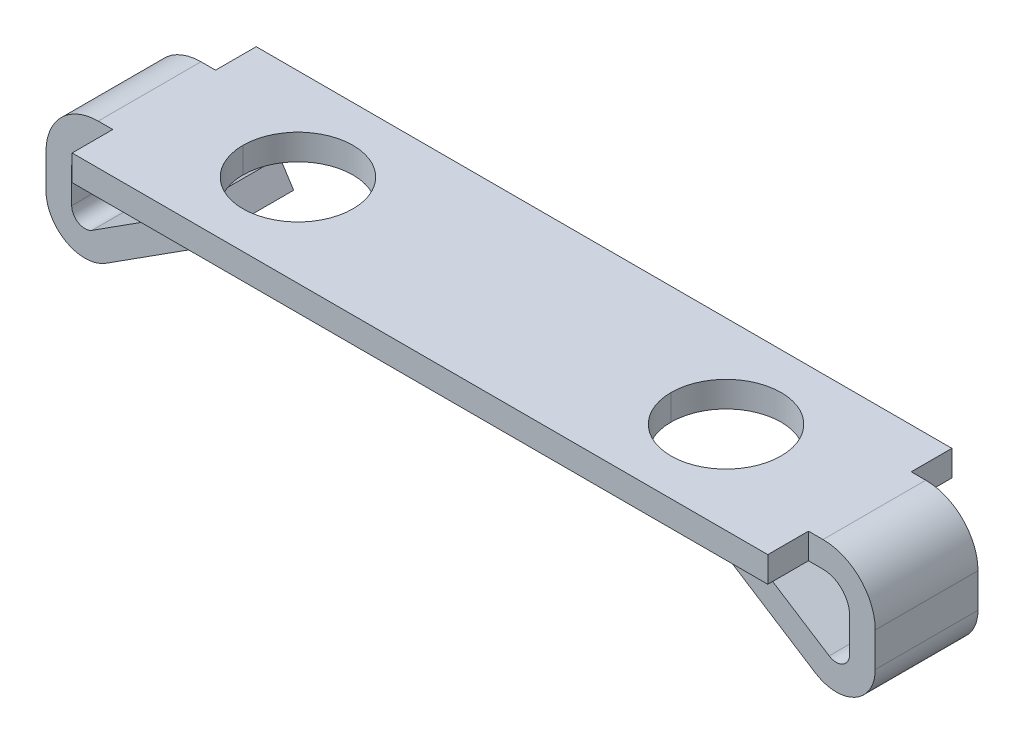
ISO-10303-21;
HEADER;
FILE_DESCRIPTION(('STEP AP214'),'2;1');
FILE_NAME('part.step','',(''),(''),'','','');
FILE_SCHEMA(('AUTOMOTIVE_DESIGN { 1 0 10303 214 1 1 1 1 }'));
ENDSEC;
DATA;
#1=APPLICATION_CONTEXT('core data for automotive mechanical design processes');
#2=APPLICATION_PROTOCOL_DEFINITION('international standard','automotive_design',2000,#1);
#3=PRODUCT_CONTEXT('',#1,'mechanical');
#4=PRODUCT('Part','Part','',(#3));
#5=PRODUCT_RELATED_PRODUCT_CATEGORY('part','',(#4));
#6=PRODUCT_DEFINITION_FORMATION('','',#4);
#7=PRODUCT_DEFINITION_CONTEXT('part definition',#1,'design');
#8=PRODUCT_DEFINITION('design','',#6,#7);
#9=PRODUCT_DEFINITION_SHAPE('','',#8);
#10=(LENGTH_UNIT() NAMED_UNIT(*) SI_UNIT(.MILLI.,.METRE.));
#11=(NAMED_UNIT(*) PLANE_ANGLE_UNIT() SI_UNIT($,.RADIAN.));
#12=(NAMED_UNIT(*) SI_UNIT($,.STERADIAN.) SOLID_ANGLE_UNIT());
#13=UNCERTAINTY_MEASURE_WITH_UNIT(LENGTH_MEASURE(1.E-05),#10,'distance_accuracy_value','');
#14=(GEOMETRIC_REPRESENTATION_CONTEXT(3) GLOBAL_UNCERTAINTY_ASSIGNED_CONTEXT((#13)) GLOBAL_UNIT_ASSIGNED_CONTEXT((#10,
#11,#12)) REPRESENTATION_CONTEXT('',''));
#15=CARTESIAN_POINT('',(0.,0.,0.));
#16=DIRECTION('',(0.,0.,1.));
#17=DIRECTION('',(1.,0.,0.));
#18=AXIS2_PLACEMENT_3D('',#15,#16,#17);
#19=CARTESIAN_POINT('',(21.50018814,1.524,3.048));
#20=DIRECTION('',(0.,-1.,0.));
#21=DIRECTION('',(0.,0.,-1.));
#22=AXIS2_PLACEMENT_3D('',#19,#20,#21);
#23=PLANE('',#22);
#24=CARTESIAN_POINT('',(12.69908814,1.524,0.));
#25=DIRECTION('',(0.,1.,0.));
#26=DIRECTION('',(1.,0.,0.));
#27=AXIS2_PLACEMENT_3D('',#24,#25,#26);
#28=CIRCLE('',#27,3.2639);
#29=CARTESIAN_POINT('',(15.96298814,1.524,0.));
#30=VERTEX_POINT('',#29);
#31=CARTESIAN_POINT('',(9.43518814,1.524,0.));
#32=VERTEX_POINT('',#31);
#33=EDGE_CURVE('E11',#30,#32,#28,.T.);
#34=ORIENTED_EDGE('',*,*,#33,.F.);
#35=CARTESIAN_POINT('',(12.69908814,1.524,0.));
#36=DIRECTION('',(0.,1.,0.));
#37=DIRECTION('',(1.,0.,0.));
#38=AXIS2_PLACEMENT_3D('',#35,#36,#37);
#39=CIRCLE('',#38,3.2639);
#40=EDGE_CURVE('E25',#32,#30,#39,.T.);
#41=ORIENTED_EDGE('',*,*,#40,.F.);
#42=EDGE_LOOP('',(#34,#41));
#43=FACE_BOUND('',#42,.T.);
#44=CARTESIAN_POINT('',(-12.69908814,1.524,0.));
#45=DIRECTION('',(0.,1.,0.));
#46=DIRECTION('',(1.,0.,0.));
#47=AXIS2_PLACEMENT_3D('',#44,#45,#46);
#48=CIRCLE('',#47,3.2639);
#49=CARTESIAN_POINT('',(-9.43518814,1.524,0.));
#50=VERTEX_POINT('',#49);
#51=CARTESIAN_POINT('',(-15.96298814,1.524,0.));
#52=VERTEX_POINT('',#51);
#53=EDGE_CURVE('E617',#50,#52,#48,.T.);
#54=ORIENTED_EDGE('',*,*,#53,.F.);
#55=CARTESIAN_POINT('',(-12.69908814,1.524,0.));
#56=DIRECTION('',(0.,1.,0.));
#57=DIRECTION('',(1.,0.,0.));
#58=AXIS2_PLACEMENT_3D('',#55,#56,#57);
#59=CIRCLE('',#58,3.2639);
#60=EDGE_CURVE('E612',#52,#50,#59,.T.);
#61=ORIENTED_EDGE('',*,*,#60,.F.);
#62=EDGE_LOOP('',(#54,#61));
#63=FACE_BOUND('',#62,.T.);
#64=DIRECTION('',(0.,0.,-1.));
#65=VECTOR('',#64,1.);
#66=CARTESIAN_POINT('',(20.63658814,1.524,5.461));
#67=LINE('',#66,#65);
#68=CARTESIAN_POINT('',(20.63658814,1.524,5.461));
#69=VERTEX_POINT('',#68);
#70=CARTESIAN_POINT('',(20.63658814,1.524,3.048));
#71=VERTEX_POINT('',#70);
#72=EDGE_CURVE('E608',#69,#71,#67,.T.);
#73=ORIENTED_EDGE('',*,*,#72,.T.);
#74=DIRECTION('',(-1.,0.,0.));
#75=VECTOR('',#74,1.);
#76=CARTESIAN_POINT('',(21.50018814,1.524,3.048));
#77=LINE('',#76,#75);
#78=CARTESIAN_POINT('',(21.50018814,1.524,3.048));
#79=VERTEX_POINT('',#78);
#80=EDGE_CURVE('E603',#79,#71,#77,.T.);
#81=ORIENTED_EDGE('',*,*,#80,.F.);
#82=DIRECTION('',(0.,0.,-1.));
#83=VECTOR('',#82,1.);
#84=CARTESIAN_POINT('',(21.50018814,1.524,3.048));
#85=LINE('',#84,#83);
#86=CARTESIAN_POINT('',(21.50018814,1.524,-3.048));
#87=VERTEX_POINT('',#86);
#88=EDGE_CURVE('E599',#79,#87,#85,.T.);
#89=ORIENTED_EDGE('',*,*,#88,.T.);
#90=DIRECTION('',(-1.,0.,0.));
#91=VECTOR('',#90,1.);
#92=CARTESIAN_POINT('',(21.50018814,1.524,-3.048));
#93=LINE('',#92,#91);
#94=CARTESIAN_POINT('',(20.63658814,1.524,-3.048));
#95=VERTEX_POINT('',#94);
#96=EDGE_CURVE('E595',#87,#95,#93,.T.);
#97=ORIENTED_EDGE('',*,*,#96,.T.);
#98=DIRECTION('',(0.,0.,-1.));
#99=VECTOR('',#98,1.);
#100=CARTESIAN_POINT('',(20.63658814,1.524,5.461));
#101=LINE('',#100,#99);
#102=CARTESIAN_POINT('',(20.63658814,1.524,-5.461));
#103=VERTEX_POINT('',#102);
#104=EDGE_CURVE('E591',#95,#103,#101,.T.);
#105=ORIENTED_EDGE('',*,*,#104,.T.);
#106=DIRECTION('',(-1.,0.,0.));
#107=VECTOR('',#106,1.);
#108=CARTESIAN_POINT('',(20.63658814,1.524,-5.461));
#109=LINE('',#108,#107);
#110=CARTESIAN_POINT('',(-20.63658814,1.524,-5.461));
#111=VERTEX_POINT('',#110);
#112=EDGE_CURVE('E587',#103,#111,#109,.T.);
#113=ORIENTED_EDGE('',*,*,#112,.T.);
#114=DIRECTION('',(0.,0.,1.));
#115=VECTOR('',#114,1.);
#116=CARTESIAN_POINT('',(-20.63658814,1.524,-5.461));
#117=LINE('',#116,#115);
#118=CARTESIAN_POINT('',(-20.63658814,1.524,-3.048));
#119=VERTEX_POINT('',#118);
#120=EDGE_CURVE('E583',#111,#119,#117,.T.);
#121=ORIENTED_EDGE('',*,*,#120,.T.);
#122=DIRECTION('',(-1.,0.,0.));
#123=VECTOR('',#122,1.);
#124=CARTESIAN_POINT('',(21.50018814,1.524,-3.048));
#125=LINE('',#124,#123);
#126=CARTESIAN_POINT('',(-21.50018814,1.524,-3.048));
#127=VERTEX_POINT('',#126);
#128=EDGE_CURVE('E579',#119,#127,#125,.T.);
#129=ORIENTED_EDGE('',*,*,#128,.T.);
#130=DIRECTION('',(0.,0.,-1.));
#131=VECTOR('',#130,1.);
#132=CARTESIAN_POINT('',(-21.50018814,1.524,3.048));
#133=LINE('',#132,#131);
#134=CARTESIAN_POINT('',(-21.50018814,1.524,3.048));
#135=VERTEX_POINT('',#134);
#136=EDGE_CURVE('E574',#135,#127,#133,.T.);
#137=ORIENTED_EDGE('',*,*,#136,.F.);
#138=DIRECTION('',(-1.,0.,0.));
#139=VECTOR('',#138,1.);
#140=CARTESIAN_POINT('',(21.50018814,1.524,3.048));
#141=LINE('',#140,#139);
#142=CARTESIAN_POINT('',(-20.63658814,1.524,3.048));
#143=VERTEX_POINT('',#142);
#144=EDGE_CURVE('E569',#143,#135,#141,.T.);
#145=ORIENTED_EDGE('',*,*,#144,.F.);
#146=DIRECTION('',(0.,0.,1.));
#147=VECTOR('',#146,1.);
#148=CARTESIAN_POINT('',(-20.63658814,1.524,-5.461));
#149=LINE('',#148,#147);
#150=CARTESIAN_POINT('',(-20.63658814,1.524,5.461));
#151=VERTEX_POINT('',#150);
#152=EDGE_CURVE('E565',#143,#151,#149,.T.);
#153=ORIENTED_EDGE('',*,*,#152,.T.);
#154=DIRECTION('',(1.,0.,0.));
#155=VECTOR('',#154,1.);
#156=CARTESIAN_POINT('',(-20.63658814,1.524,5.461));
#157=LINE('',#156,#155);
#158=EDGE_CURVE('E561',#151,#69,#157,.T.);
#159=ORIENTED_EDGE('',*,*,#158,.T.);
#160=EDGE_LOOP('',(#73,#81,#89,#97,#105,#113,#121,#129,#137,#145,#153,#159));
#161=FACE_BOUND('',#160,.T.);
#162=ADVANCED_FACE('F17',(#43,#63,#161),#23,.F.);
#163=CARTESIAN_POINT('',(-20.63658814,1.524,5.461));
#164=DIRECTION('',(0.,0.,-1.));
#165=DIRECTION('',(-1.,0.,0.));
#166=AXIS2_PLACEMENT_3D('',#163,#164,#165);
#167=PLANE('',#166);
#168=DIRECTION('',(1.,0.,0.));
#169=VECTOR('',#168,1.);
#170=CARTESIAN_POINT('',(-20.63658814,0.,5.461));
#171=LINE('',#170,#169);
#172=CARTESIAN_POINT('',(-20.63658814,0.,5.461));
#173=VERTEX_POINT('',#172);
#174=CARTESIAN_POINT('',(20.63658814,0.,5.461));
#175=VERTEX_POINT('',#174);
#176=EDGE_CURVE('E557',#173,#175,#171,.T.);
#177=ORIENTED_EDGE('',*,*,#176,.T.);
#178=DIRECTION('',(0.,-1.,0.));
#179=VECTOR('',#178,1.);
#180=CARTESIAN_POINT('',(20.63658814,1.524,5.461));
#181=LINE('',#180,#179);
#182=EDGE_CURVE('E552',#69,#175,#181,.T.);
#183=ORIENTED_EDGE('',*,*,#182,.F.);
#184=ORIENTED_EDGE('',*,*,#158,.F.);
#185=DIRECTION('',(0.,-1.,0.));
#186=VECTOR('',#185,1.);
#187=CARTESIAN_POINT('',(-20.63658814,1.524,5.461));
#188=LINE('',#187,#186);
#189=EDGE_CURVE('E548',#151,#173,#188,.T.);
#190=ORIENTED_EDGE('',*,*,#189,.T.);
#191=EDGE_LOOP('',(#177,#183,#184,#190));
#192=FACE_BOUND('',#191,.T.);
#193=ADVANCED_FACE('F723',(#192),#167,.F.);
#194=CARTESIAN_POINT('',(-20.63658814,1.524,-5.461));
#195=DIRECTION('',(1.,0.,0.));
#196=DIRECTION('',(0.,0.,-1.));
#197=AXIS2_PLACEMENT_3D('',#194,#195,#196);
#198=PLANE('',#197);
#199=DIRECTION('',(0.,1.,0.));
#200=VECTOR('',#199,1.);
#201=CARTESIAN_POINT('',(-20.63658814,-3.60679999999942,3.048));
#202=LINE('',#201,#200);
#203=CARTESIAN_POINT('',(-20.63658814,0.,3.048));
#204=VERTEX_POINT('',#203);
#205=EDGE_CURVE('E543',#204,#143,#202,.T.);
#206=ORIENTED_EDGE('',*,*,#205,.F.);
#207=DIRECTION('',(0.,0.,1.));
#208=VECTOR('',#207,1.);
#209=CARTESIAN_POINT('',(-20.63658814,0.,-5.461));
#210=LINE('',#209,#208);
#211=EDGE_CURVE('E538',#204,#173,#210,.T.);
#212=ORIENTED_EDGE('',*,*,#211,.T.);
#213=ORIENTED_EDGE('',*,*,#189,.F.);
#214=ORIENTED_EDGE('',*,*,#152,.F.);
#215=EDGE_LOOP('',(#206,#212,#213,#214));
#216=FACE_BOUND('',#215,.T.);
#217=ADVANCED_FACE('F728',(#216),#198,.F.);
#218=CARTESIAN_POINT('',(-21.50018814,0.,3.048));
#219=DIRECTION('',(0.,1.,0.));
#220=DIRECTION('',(0.,0.,1.));
#221=AXIS2_PLACEMENT_3D('',#218,#219,#220);
#222=PLANE('',#221);
#223=CARTESIAN_POINT('',(12.69908814,0.,0.));
#224=DIRECTION('',(0.,1.,0.));
#225=DIRECTION('',(1.,0.,0.));
#226=AXIS2_PLACEMENT_3D('',#223,#224,#225);
#227=CIRCLE('',#226,3.2639);
#228=CARTESIAN_POINT('',(15.96298814,0.,0.));
#229=VERTEX_POINT('',#228);
#230=CARTESIAN_POINT('',(9.43518814,0.,0.));
#231=VERTEX_POINT('',#230);
#232=EDGE_CURVE('E534',#229,#231,#227,.T.);
#233=ORIENTED_EDGE('',*,*,#232,.T.);
#234=CARTESIAN_POINT('',(12.69908814,0.,0.));
#235=DIRECTION('',(0.,1.,0.));
#236=DIRECTION('',(1.,0.,0.));
#237=AXIS2_PLACEMENT_3D('',#234,#235,#236);
#238=CIRCLE('',#237,3.2639);
#239=EDGE_CURVE('E530',#231,#229,#238,.T.);
#240=ORIENTED_EDGE('',*,*,#239,.T.);
#241=EDGE_LOOP('',(#233,#240));
#242=FACE_BOUND('',#241,.T.);
#243=CARTESIAN_POINT('',(-12.69908814,0.,0.));
#244=DIRECTION('',(0.,1.,0.));
#245=DIRECTION('',(1.,0.,0.));
#246=AXIS2_PLACEMENT_3D('',#243,#244,#245);
#247=CIRCLE('',#246,3.2639);
#248=CARTESIAN_POINT('',(-9.43518814,0.,0.));
#249=VERTEX_POINT('',#248);
#250=CARTESIAN_POINT('',(-15.96298814,0.,0.));
#251=VERTEX_POINT('',#250);
#252=EDGE_CURVE('E526',#249,#251,#247,.T.);
#253=ORIENTED_EDGE('',*,*,#252,.T.);
#254=CARTESIAN_POINT('',(-12.69908814,0.,0.));
#255=DIRECTION('',(0.,1.,0.));
#256=DIRECTION('',(1.,0.,0.));
#257=AXIS2_PLACEMENT_3D('',#254,#255,#256);
#258=CIRCLE('',#257,3.2639);
#259=EDGE_CURVE('E522',#251,#249,#258,.T.);
#260=ORIENTED_EDGE('',*,*,#259,.T.);
#261=EDGE_LOOP('',(#253,#260));
#262=FACE_BOUND('',#261,.T.);
#263=DIRECTION('',(0.,0.,-1.));
#264=VECTOR('',#263,1.);
#265=CARTESIAN_POINT('',(20.63658814,0.,5.461));
#266=LINE('',#265,#264);
#267=CARTESIAN_POINT('',(20.63658814,0.,-3.048));
#268=VERTEX_POINT('',#267);
#269=CARTESIAN_POINT('',(20.63658814,0.,-5.461));
#270=VERTEX_POINT('',#269);
#271=EDGE_CURVE('E517',#268,#270,#266,.T.);
#272=ORIENTED_EDGE('',*,*,#271,.F.);
#273=DIRECTION('',(1.,0.,0.));
#274=VECTOR('',#273,1.);
#275=CARTESIAN_POINT('',(-21.50018814,0.,-3.048));
#276=LINE('',#275,#274);
#277=CARTESIAN_POINT('',(21.50018814,0.,-3.048));
#278=VERTEX_POINT('',#277);
#279=EDGE_CURVE('E513',#268,#278,#276,.T.);
#280=ORIENTED_EDGE('',*,*,#279,.T.);
#281=DIRECTION('',(0.,0.,-1.));
#282=VECTOR('',#281,1.);
#283=CARTESIAN_POINT('',(21.50018814,0.,3.048));
#284=LINE('',#283,#282);
#285=CARTESIAN_POINT('',(21.50018814,0.,3.048));
#286=VERTEX_POINT('',#285);
#287=EDGE_CURVE('E508',#286,#278,#284,.T.);
#288=ORIENTED_EDGE('',*,*,#287,.F.);
#289=DIRECTION('',(1.,0.,0.));
#290=VECTOR('',#289,1.);
#291=CARTESIAN_POINT('',(-21.50018814,0.,3.048));
#292=LINE('',#291,#290);
#293=CARTESIAN_POINT('',(20.63658814,0.,3.048));
#294=VERTEX_POINT('',#293);
#295=EDGE_CURVE('E503',#294,#286,#292,.T.);
#296=ORIENTED_EDGE('',*,*,#295,.F.);
#297=DIRECTION('',(0.,0.,-1.));
#298=VECTOR('',#297,1.);
#299=CARTESIAN_POINT('',(20.63658814,0.,5.461));
#300=LINE('',#299,#298);
#301=EDGE_CURVE('E498',#175,#294,#300,.T.);
#302=ORIENTED_EDGE('',*,*,#301,.F.);
#303=ORIENTED_EDGE('',*,*,#176,.F.);
#304=ORIENTED_EDGE('',*,*,#211,.F.);
#305=DIRECTION('',(1.,0.,0.));
#306=VECTOR('',#305,1.);
#307=CARTESIAN_POINT('',(-21.50018814,0.,3.048));
#308=LINE('',#307,#306);
#309=CARTESIAN_POINT('',(-21.50018814,0.,3.048));
#310=VERTEX_POINT('',#309);
#311=EDGE_CURVE('E494',#310,#204,#308,.T.);
#312=ORIENTED_EDGE('',*,*,#311,.F.);
#313=DIRECTION('',(0.,0.,-1.));
#314=VECTOR('',#313,1.);
#315=CARTESIAN_POINT('',(-21.50018814,0.,3.048));
#316=LINE('',#315,#314);
#317=CARTESIAN_POINT('',(-21.50018814,0.,-3.048));
#318=VERTEX_POINT('',#317);
#319=EDGE_CURVE('E240',#310,#318,#316,.T.);
#320=ORIENTED_EDGE('',*,*,#319,.T.);
#321=DIRECTION('',(1.,0.,0.));
#322=VECTOR('',#321,1.);
#323=CARTESIAN_POINT('',(-21.50018814,0.,-3.048));
#324=LINE('',#323,#322);
#325=CARTESIAN_POINT('',(-20.63658814,0.,-3.048));
#326=VERTEX_POINT('',#325);
#327=EDGE_CURVE('E487',#318,#326,#324,.T.);
#328=ORIENTED_EDGE('',*,*,#327,.T.);
#329=DIRECTION('',(0.,0.,1.));
#330=VECTOR('',#329,1.);
#331=CARTESIAN_POINT('',(-20.63658814,0.,-5.461));
#332=LINE('',#331,#330);
#333=CARTESIAN_POINT('',(-20.63658814,0.,-5.461));
#334=VERTEX_POINT('',#333);
#335=EDGE_CURVE('E482',#334,#326,#332,.T.);
#336=ORIENTED_EDGE('',*,*,#335,.F.);
#337=DIRECTION('',(-1.,0.,0.));
#338=VECTOR('',#337,1.);
#339=CARTESIAN_POINT('',(20.63658814,0.,-5.461));
#340=LINE('',#339,#338);
#341=EDGE_CURVE('E477',#270,#334,#340,.T.);
#342=ORIENTED_EDGE('',*,*,#341,.F.);
#343=EDGE_LOOP('',(#272,#280,#288,#296,#302,#303,#304,#312,#320,#328,#336,#342));
#344=FACE_BOUND('',#343,.T.);
#345=ADVANCED_FACE('F691',(#242,#262,#344),#222,.F.);
#346=CARTESIAN_POINT('',(20.63658814,1.524,-5.461));
#347=DIRECTION('',(0.,0.,1.));
#348=DIRECTION('',(1.,0.,0.));
#349=AXIS2_PLACEMENT_3D('',#346,#347,#348);
#350=PLANE('',#349);
#351=ORIENTED_EDGE('',*,*,#341,.T.);
#352=DIRECTION('',(0.,-1.,0.));
#353=VECTOR('',#352,1.);
#354=CARTESIAN_POINT('',(-20.63658814,1.524,-5.461));
#355=LINE('',#354,#353);
#356=EDGE_CURVE('E472',#111,#334,#355,.T.);
#357=ORIENTED_EDGE('',*,*,#356,.F.);
#358=ORIENTED_EDGE('',*,*,#112,.F.);
#359=DIRECTION('',(0.,-1.,0.));
#360=VECTOR('',#359,1.);
#361=CARTESIAN_POINT('',(20.63658814,1.524,-5.461));
#362=LINE('',#361,#360);
#363=EDGE_CURVE('E467',#103,#270,#362,.T.);
#364=ORIENTED_EDGE('',*,*,#363,.T.);
#365=EDGE_LOOP('',(#351,#357,#358,#364));
#366=FACE_BOUND('',#365,.T.);
#367=ADVANCED_FACE('F698',(#366),#350,.F.);
#368=CARTESIAN_POINT('',(20.63658814,1.524,5.461));
#369=DIRECTION('',(-1.,0.,0.));
#370=DIRECTION('',(0.,0.,1.));
#371=AXIS2_PLACEMENT_3D('',#368,#369,#370);
#372=PLANE('',#371);
#373=ORIENTED_EDGE('',*,*,#104,.F.);
#374=DIRECTION('',(0.,-1.,0.));
#375=VECTOR('',#374,1.);
#376=CARTESIAN_POINT('',(20.63658814,-3.60679999999942,-3.048));
#377=LINE('',#376,#375);
#378=EDGE_CURVE('E462',#95,#268,#377,.T.);
#379=ORIENTED_EDGE('',*,*,#378,.T.);
#380=ORIENTED_EDGE('',*,*,#271,.T.);
#381=ORIENTED_EDGE('',*,*,#363,.F.);
#382=EDGE_LOOP('',(#373,#379,#380,#381));
#383=FACE_BOUND('',#382,.T.);
#384=ADVANCED_FACE('F704',(#383),#372,.F.);
#385=CARTESIAN_POINT('',(-22.2875881399995,-3.60679999999942,-3.048));
#386=DIRECTION('',(0.,0.,1.));
#387=DIRECTION('',(1.,0.,0.));
#388=AXIS2_PLACEMENT_3D('',#385,#386,#387);
#389=PLANE('',#388);
#390=ORIENTED_EDGE('',*,*,#378,.F.);
#391=ORIENTED_EDGE('',*,*,#96,.F.);
#392=CARTESIAN_POINT('',(21.5001881400002,-1.57479999999979,-3.048));
#393=DIRECTION('',(0.,0.,1.));
#394=DIRECTION('',(1.,0.,0.));
#395=AXIS2_PLACEMENT_3D('',#392,#393,#394);
#396=CIRCLE('',#395,3.0988);
#397=CARTESIAN_POINT('',(24.59898814,-1.5748,-3.048));
#398=VERTEX_POINT('',#397);
#399=EDGE_CURVE('E457',#398,#87,#396,.T.);
#400=ORIENTED_EDGE('',*,*,#399,.F.);
#401=DIRECTION('',(0.,1.,0.));
#402=VECTOR('',#401,1.);
#403=CARTESIAN_POINT('',(24.59898814,-3.6068,-3.048));
#404=LINE('',#403,#402);
#405=CARTESIAN_POINT('',(24.59898814,-3.6068,-3.048));
#406=VERTEX_POINT('',#405);
#407=EDGE_CURVE('E452',#406,#398,#404,.T.);
#408=ORIENTED_EDGE('',*,*,#407,.F.);
#409=CARTESIAN_POINT('',(22.2875881399995,-3.60679999999942,-3.048));
#410=DIRECTION('',(0.,0.,1.));
#411=DIRECTION('',(1.,0.,0.));
#412=AXIS2_PLACEMENT_3D('',#409,#410,#411);
#413=CIRCLE('',#412,2.3114);
#414=CARTESIAN_POINT('',(21.041911256647,-5.5538128562188,-3.048));
#415=VERTEX_POINT('',#414);
#416=EDGE_CURVE('E447',#415,#406,#413,.T.);
#417=ORIENTED_EDGE('',*,*,#416,.F.);
#418=DIRECTION('',(0.842352191839881,-0.538927439366886,0.));
#419=VECTOR('',#418,1.);
#420=CARTESIAN_POINT('',(16.002,-2.329334432,-3.048));
#421=LINE('',#420,#419);
#422=CARTESIAN_POINT('',(16.002,-2.329334432,-3.048));
#423=VERTEX_POINT('',#422);
#424=EDGE_CURVE('E442',#423,#415,#421,.T.);
#425=ORIENTED_EDGE('',*,*,#424,.F.);
#426=DIRECTION('',(-0.538927439366818,-0.842352191839924,0.));
#427=VECTOR('',#426,1.);
#428=CARTESIAN_POINT('',(16.823325417595,-1.045589691636,-3.048));
#429=LINE('',#428,#427);
#430=CARTESIAN_POINT('',(16.823325417595,-1.045589691636,-3.048));
#431=VERTEX_POINT('',#430);
#432=EDGE_CURVE('E437',#431,#423,#429,.T.);
#433=ORIENTED_EDGE('',*,*,#432,.F.);
#434=DIRECTION('',(-0.842352191839937,0.538927439366798,0.));
#435=VECTOR('',#434,1.);
#436=CARTESIAN_POINT('',(21.863236674243,-4.27006811585469,-3.048));
#437=LINE('',#436,#435);
#438=CARTESIAN_POINT('',(21.863236674243,-4.27006811585469,-3.048));
#439=VERTEX_POINT('',#438);
#440=EDGE_CURVE('E432',#439,#431,#437,.T.);
#441=ORIENTED_EDGE('',*,*,#440,.F.);
#442=CARTESIAN_POINT('',(22.2875881400002,-3.60679999999997,-3.048));
#443=DIRECTION('',(0.,0.,1.));
#444=DIRECTION('',(1.,0.,0.));
#445=AXIS2_PLACEMENT_3D('',#442,#443,#444);
#446=CIRCLE('',#445,0.7874);
#447=CARTESIAN_POINT('',(23.07498814,-3.6068,-3.048));
#448=VERTEX_POINT('',#447);
#449=EDGE_CURVE('E428',#439,#448,#446,.T.);
#450=ORIENTED_EDGE('',*,*,#449,.T.);
#451=DIRECTION('',(0.,-1.,0.));
#452=VECTOR('',#451,1.);
#453=CARTESIAN_POINT('',(23.07498814,-1.5748,-3.048));
#454=LINE('',#453,#452);
#455=CARTESIAN_POINT('',(23.07498814,-1.5748,-3.048));
#456=VERTEX_POINT('',#455);
#457=EDGE_CURVE('E423',#456,#448,#454,.T.);
#458=ORIENTED_EDGE('',*,*,#457,.F.);
#459=CARTESIAN_POINT('',(21.5001881400007,-1.57479999999926,-3.048));
#460=DIRECTION('',(0.,0.,1.));
#461=DIRECTION('',(1.,0.,0.));
#462=AXIS2_PLACEMENT_3D('',#459,#460,#461);
#463=CIRCLE('',#462,1.5748);
#464=EDGE_CURVE('E418',#456,#278,#463,.T.);
#465=ORIENTED_EDGE('',*,*,#464,.T.);
#466=ORIENTED_EDGE('',*,*,#279,.F.);
#467=EDGE_LOOP('',(#390,#391,#400,#408,#417,#425,#433,#441,#450,#458,#465,#466));
#468=FACE_BOUND('',#467,.T.);
#469=ADVANCED_FACE('F707',(#468),#389,.F.);
#470=CARTESIAN_POINT('',(21.5001881400007,-1.57479999999926,3.048));
#471=DIRECTION('',(0.,0.,1.));
#472=DIRECTION('',(-0.707106781186548,-0.707106781186547,0.));
#473=AXIS2_PLACEMENT_3D('',#470,#471,#472);
#474=CYLINDRICAL_SURFACE('',#473,1.5748);
#475=ORIENTED_EDGE('',*,*,#287,.T.);
#476=ORIENTED_EDGE('',*,*,#464,.F.);
#477=DIRECTION('',(0.,0.,-1.));
#478=VECTOR('',#477,1.);
#479=CARTESIAN_POINT('',(23.07498814,-1.5748,3.048));
#480=LINE('',#479,#478);
#481=CARTESIAN_POINT('',(23.07498814,-1.5748,3.048));
#482=VERTEX_POINT('',#481);
#483=EDGE_CURVE('E413',#482,#456,#480,.T.);
#484=ORIENTED_EDGE('',*,*,#483,.F.);
#485=CARTESIAN_POINT('',(21.5001881400007,-1.57479999999926,3.048));
#486=DIRECTION('',(0.,0.,1.));
#487=DIRECTION('',(1.,0.,0.));
#488=AXIS2_PLACEMENT_3D('',#485,#486,#487);
#489=CIRCLE('',#488,1.5748);
#490=EDGE_CURVE('E408',#482,#286,#489,.T.);
#491=ORIENTED_EDGE('',*,*,#490,.T.);
#492=EDGE_LOOP('',(#475,#476,#484,#491));
#493=FACE_BOUND('',#492,.T.);
#494=ADVANCED_FACE('F710',(#493),#474,.F.);
#495=CARTESIAN_POINT('',(-22.2875881399995,-3.60679999999942,3.048));
#496=DIRECTION('',(0.,0.,1.));
#497=DIRECTION('',(1.,0.,0.));
#498=AXIS2_PLACEMENT_3D('',#495,#496,#497);
#499=PLANE('',#498);
#500=ORIENTED_EDGE('',*,*,#80,.T.);
#501=DIRECTION('',(0.,-1.,0.));
#502=VECTOR('',#501,1.);
#503=CARTESIAN_POINT('',(20.63658814,-3.60679999999942,3.048));
#504=LINE('',#503,#502);
#505=EDGE_CURVE('E403',#71,#294,#504,.T.);
#506=ORIENTED_EDGE('',*,*,#505,.T.);
#507=ORIENTED_EDGE('',*,*,#295,.T.);
#508=ORIENTED_EDGE('',*,*,#490,.F.);
#509=DIRECTION('',(0.,-1.,0.));
#510=VECTOR('',#509,1.);
#511=CARTESIAN_POINT('',(23.07498814,-1.5748,3.048));
#512=LINE('',#511,#510);
#513=CARTESIAN_POINT('',(23.07498814,-3.6068,3.048));
#514=VERTEX_POINT('',#513);
#515=EDGE_CURVE('E399',#482,#514,#512,.T.);
#516=ORIENTED_EDGE('',*,*,#515,.T.);
#517=CARTESIAN_POINT('',(22.2875881400002,-3.60679999999997,3.048));
#518=DIRECTION('',(0.,0.,1.));
#519=DIRECTION('',(1.,0.,0.));
#520=AXIS2_PLACEMENT_3D('',#517,#518,#519);
#521=CIRCLE('',#520,0.7874);
#522=CARTESIAN_POINT('',(21.863236674243,-4.27006811585469,3.048));
#523=VERTEX_POINT('',#522);
#524=EDGE_CURVE('E394',#523,#514,#521,.T.);
#525=ORIENTED_EDGE('',*,*,#524,.F.);
#526=DIRECTION('',(-0.842352191839937,0.538927439366798,0.));
#527=VECTOR('',#526,1.);
#528=CARTESIAN_POINT('',(21.863236674243,-4.27006811585469,3.048));
#529=LINE('',#528,#527);
#530=CARTESIAN_POINT('',(16.823325417595,-1.045589691636,3.048));
#531=VERTEX_POINT('',#530);
#532=EDGE_CURVE('E390',#523,#531,#529,.T.);
#533=ORIENTED_EDGE('',*,*,#532,.T.);
#534=DIRECTION('',(-0.538927439366818,-0.842352191839924,0.));
#535=VECTOR('',#534,1.);
#536=CARTESIAN_POINT('',(16.823325417595,-1.045589691636,3.048));
#537=LINE('',#536,#535);
#538=CARTESIAN_POINT('',(16.002,-2.329334432,3.048));
#539=VERTEX_POINT('',#538);
#540=EDGE_CURVE('E386',#531,#539,#537,.T.);
#541=ORIENTED_EDGE('',*,*,#540,.T.);
#542=DIRECTION('',(0.842352191839881,-0.538927439366886,0.));
#543=VECTOR('',#542,1.);
#544=CARTESIAN_POINT('',(16.002,-2.329334432,3.048));
#545=LINE('',#544,#543);
#546=CARTESIAN_POINT('',(21.041911256647,-5.5538128562188,3.048));
#547=VERTEX_POINT('',#546);
#548=EDGE_CURVE('E382',#539,#547,#545,.T.);
#549=ORIENTED_EDGE('',*,*,#548,.T.);
#550=CARTESIAN_POINT('',(22.2875881399995,-3.60679999999942,3.048));
#551=DIRECTION('',(0.,0.,1.));
#552=DIRECTION('',(1.,0.,0.));
#553=AXIS2_PLACEMENT_3D('',#550,#551,#552);
#554=CIRCLE('',#553,2.3114);
#555=CARTESIAN_POINT('',(24.59898814,-3.6068,3.048));
#556=VERTEX_POINT('',#555);
#557=EDGE_CURVE('E378',#547,#556,#554,.T.);
#558=ORIENTED_EDGE('',*,*,#557,.T.);
#559=DIRECTION('',(0.,1.,0.));
#560=VECTOR('',#559,1.);
#561=CARTESIAN_POINT('',(24.59898814,-3.6068,3.048));
#562=LINE('',#561,#560);
#563=CARTESIAN_POINT('',(24.59898814,-1.5748,3.048));
#564=VERTEX_POINT('',#563);
#565=EDGE_CURVE('E374',#556,#564,#562,.T.);
#566=ORIENTED_EDGE('',*,*,#565,.T.);
#567=CARTESIAN_POINT('',(21.5001881400002,-1.57479999999979,3.048));
#568=DIRECTION('',(0.,0.,1.));
#569=DIRECTION('',(1.,0.,0.));
#570=AXIS2_PLACEMENT_3D('',#567,#568,#569);
#571=CIRCLE('',#570,3.0988);
#572=EDGE_CURVE('E369',#564,#79,#571,.T.);
#573=ORIENTED_EDGE('',*,*,#572,.T.);
#574=EDGE_LOOP('',(#500,#506,#507,#508,#516,#525,#533,#541,#549,#558,#566,#573));
#575=FACE_BOUND('',#574,.T.);
#576=ADVANCED_FACE('F716',(#575),#499,.T.);
#577=CARTESIAN_POINT('',(21.5001881400002,-1.57479999999979,3.048));
#578=DIRECTION('',(0.,0.,1.));
#579=DIRECTION('',(-0.707106781186547,-0.707106781186548,0.));
#580=AXIS2_PLACEMENT_3D('',#577,#578,#579);
#581=CYLINDRICAL_SURFACE('',#580,3.0988);
#582=ORIENTED_EDGE('',*,*,#399,.T.);
#583=ORIENTED_EDGE('',*,*,#88,.F.);
#584=ORIENTED_EDGE('',*,*,#572,.F.);
#585=DIRECTION('',(0.,0.,-1.));
#586=VECTOR('',#585,1.);
#587=CARTESIAN_POINT('',(24.59898814,-1.5748,3.048));
#588=LINE('',#587,#586);
#589=EDGE_CURVE('E364',#564,#398,#588,.T.);
#590=ORIENTED_EDGE('',*,*,#589,.T.);
#591=EDGE_LOOP('',(#582,#583,#584,#590));
#592=FACE_BOUND('',#591,.T.);
#593=ADVANCED_FACE('F790',(#592),#581,.T.);
#594=CARTESIAN_POINT('',(24.59898814,-3.6068,3.048));
#595=DIRECTION('',(-1.,0.,0.));
#596=DIRECTION('',(0.,0.,1.));
#597=AXIS2_PLACEMENT_3D('',#594,#595,#596);
#598=PLANE('',#597);
#599=ORIENTED_EDGE('',*,*,#407,.T.);
#600=ORIENTED_EDGE('',*,*,#589,.F.);
#601=ORIENTED_EDGE('',*,*,#565,.F.);
#602=DIRECTION('',(0.,0.,-1.));
#603=VECTOR('',#602,1.);
#604=CARTESIAN_POINT('',(24.59898814,-3.6068,3.048));
#605=LINE('',#604,#603);
#606=EDGE_CURVE('E359',#556,#406,#605,.T.);
#607=ORIENTED_EDGE('',*,*,#606,.T.);
#608=EDGE_LOOP('',(#599,#600,#601,#607));
#609=FACE_BOUND('',#608,.T.);
#610=ADVANCED_FACE('F793',(#609),#598,.F.);
#611=CARTESIAN_POINT('',(22.2875881399995,-3.60679999999942,3.048));
#612=DIRECTION('',(0.,0.,1.));
#613=DIRECTION('',(-0.480141937677439,0.877190811444896,0.));
#614=AXIS2_PLACEMENT_3D('',#611,#612,#613);
#615=CYLINDRICAL_SURFACE('',#614,2.3114);
#616=ORIENTED_EDGE('',*,*,#416,.T.);
#617=ORIENTED_EDGE('',*,*,#606,.F.);
#618=ORIENTED_EDGE('',*,*,#557,.F.);
#619=DIRECTION('',(0.,0.,-1.));
#620=VECTOR('',#619,1.);
#621=CARTESIAN_POINT('',(21.041911256647,-5.5538128562188,3.048));
#622=LINE('',#621,#620);
#623=EDGE_CURVE('E354',#547,#415,#622,.T.);
#624=ORIENTED_EDGE('',*,*,#623,.T.);
#625=EDGE_LOOP('',(#616,#617,#618,#624));
#626=FACE_BOUND('',#625,.T.);
#627=ADVANCED_FACE('F797',(#626),#615,.T.);
#628=CARTESIAN_POINT('',(16.002,-2.329334432,3.048));
#629=DIRECTION('',(0.538927439366886,0.842352191839881,0.));
#630=DIRECTION('',(-0.842352191839881,0.538927439366886,0.));
#631=AXIS2_PLACEMENT_3D('',#628,#629,#630);
#632=PLANE('',#631);
#633=ORIENTED_EDGE('',*,*,#424,.T.);
#634=ORIENTED_EDGE('',*,*,#623,.F.);
#635=ORIENTED_EDGE('',*,*,#548,.F.);
#636=DIRECTION('',(0.,0.,-1.));
#637=VECTOR('',#636,1.);
#638=CARTESIAN_POINT('',(16.002,-2.329334432,3.048));
#639=LINE('',#638,#637);
#640=EDGE_CURVE('E349',#539,#423,#639,.T.);
#641=ORIENTED_EDGE('',*,*,#640,.T.);
#642=EDGE_LOOP('',(#633,#634,#635,#641));
#643=FACE_BOUND('',#642,.T.);
#644=ADVANCED_FACE('F801',(#643),#632,.F.);
#645=CARTESIAN_POINT('',(16.823325417595,-1.045589691636,3.048));
#646=DIRECTION('',(0.842352191839925,-0.538927439366818,0.));
#647=DIRECTION('',(0.538927439366818,0.842352191839925,0.));
#648=AXIS2_PLACEMENT_3D('',#645,#646,#647);
#649=PLANE('',#648);
#650=ORIENTED_EDGE('',*,*,#432,.T.);
#651=ORIENTED_EDGE('',*,*,#640,.F.);
#652=ORIENTED_EDGE('',*,*,#540,.F.);
#653=DIRECTION('',(0.,0.,-1.));
#654=VECTOR('',#653,1.);
#655=CARTESIAN_POINT('',(16.823325417595,-1.045589691636,3.048));
#656=LINE('',#655,#654);
#657=EDGE_CURVE('E344',#531,#431,#656,.T.);
#658=ORIENTED_EDGE('',*,*,#657,.T.);
#659=EDGE_LOOP('',(#650,#651,#652,#658));
#660=FACE_BOUND('',#659,.T.);
#661=ADVANCED_FACE('F805',(#660),#649,.F.);
#662=CARTESIAN_POINT('',(21.863236674243,-4.27006811585469,3.048));
#663=DIRECTION('',(-0.538927439366798,-0.842352191839937,0.));
#664=DIRECTION('',(0.842352191839937,-0.538927439366798,0.));
#665=AXIS2_PLACEMENT_3D('',#662,#663,#664);
#666=PLANE('',#665);
#667=ORIENTED_EDGE('',*,*,#440,.T.);
#668=ORIENTED_EDGE('',*,*,#657,.F.);
#669=ORIENTED_EDGE('',*,*,#532,.F.);
#670=DIRECTION('',(0.,0.,-1.));
#671=VECTOR('',#670,1.);
#672=CARTESIAN_POINT('',(21.863236674243,-4.27006811585469,3.048));
#673=LINE('',#672,#671);
#674=EDGE_CURVE('E339',#523,#439,#673,.T.);
#675=ORIENTED_EDGE('',*,*,#674,.T.);
#676=EDGE_LOOP('',(#667,#668,#669,#675));
#677=FACE_BOUND('',#676,.T.);
#678=ADVANCED_FACE('F809',(#677),#666,.F.);
#679=CARTESIAN_POINT('',(22.2875881400002,-3.60679999999997,3.048));
#680=DIRECTION('',(0.,0.,1.));
#681=DIRECTION('',(-0.480141937677492,0.877190811444866,0.));
#682=AXIS2_PLACEMENT_3D('',#679,#680,#681);
#683=CYLINDRICAL_SURFACE('',#682,0.7874);
#684=DIRECTION('',(0.,0.,-1.));
#685=VECTOR('',#684,1.);
#686=CARTESIAN_POINT('',(23.07498814,-3.6068,3.048));
#687=LINE('',#686,#685);
#688=EDGE_CURVE('E334',#514,#448,#687,.T.);
#689=ORIENTED_EDGE('',*,*,#688,.T.);
#690=ORIENTED_EDGE('',*,*,#449,.F.);
#691=ORIENTED_EDGE('',*,*,#674,.F.);
#692=ORIENTED_EDGE('',*,*,#524,.T.);
#693=EDGE_LOOP('',(#689,#690,#691,#692));
#694=FACE_BOUND('',#693,.T.);
#695=ADVANCED_FACE('F813',(#694),#683,.F.);
#696=CARTESIAN_POINT('',(23.07498814,-1.5748,3.048));
#697=DIRECTION('',(1.,0.,0.));
#698=DIRECTION('',(0.,0.,-1.));
#699=AXIS2_PLACEMENT_3D('',#696,#697,#698);
#700=PLANE('',#699);
#701=ORIENTED_EDGE('',*,*,#457,.T.);
#702=ORIENTED_EDGE('',*,*,#688,.F.);
#703=ORIENTED_EDGE('',*,*,#515,.F.);
#704=ORIENTED_EDGE('',*,*,#483,.T.);
#705=EDGE_LOOP('',(#701,#702,#703,#704));
#706=FACE_BOUND('',#705,.T.);
#707=ADVANCED_FACE('F817',(#706),#700,.F.);
#708=CARTESIAN_POINT('',(20.63658814,1.524,5.461));
#709=DIRECTION('',(-1.,0.,0.));
#710=DIRECTION('',(0.,0.,1.));
#711=AXIS2_PLACEMENT_3D('',#708,#709,#710);
#712=PLANE('',#711);
#713=ORIENTED_EDGE('',*,*,#505,.F.);
#714=ORIENTED_EDGE('',*,*,#72,.F.);
#715=ORIENTED_EDGE('',*,*,#182,.T.);
#716=ORIENTED_EDGE('',*,*,#301,.T.);
#717=EDGE_LOOP('',(#713,#714,#715,#716));
#718=FACE_BOUND('',#717,.T.);
#719=ADVANCED_FACE('F719',(#718),#712,.F.);
#720=CARTESIAN_POINT('',(-20.63658814,1.524,-5.461));
#721=DIRECTION('',(1.,0.,0.));
#722=DIRECTION('',(0.,0.,-1.));
#723=AXIS2_PLACEMENT_3D('',#720,#721,#722);
#724=PLANE('',#723);
#725=ORIENTED_EDGE('',*,*,#335,.T.);
#726=DIRECTION('',(0.,1.,0.));
#727=VECTOR('',#726,1.);
#728=CARTESIAN_POINT('',(-20.63658814,-3.60679999999942,-3.048));
#729=LINE('',#728,#727);
#730=EDGE_CURVE('E329',#326,#119,#729,.T.);
#731=ORIENTED_EDGE('',*,*,#730,.T.);
#732=ORIENTED_EDGE('',*,*,#120,.F.);
#733=ORIENTED_EDGE('',*,*,#356,.T.);
#734=EDGE_LOOP('',(#725,#731,#732,#733));
#735=FACE_BOUND('',#734,.T.);
#736=ADVANCED_FACE('F693',(#735),#724,.F.);
#737=CARTESIAN_POINT('',(-22.2875881399995,-3.60679999999942,-3.048));
#738=DIRECTION('',(0.,0.,1.));
#739=DIRECTION('',(1.,0.,0.));
#740=AXIS2_PLACEMENT_3D('',#737,#738,#739);
#741=PLANE('',#740);
#742=ORIENTED_EDGE('',*,*,#730,.F.);
#743=ORIENTED_EDGE('',*,*,#327,.F.);
#744=CARTESIAN_POINT('',(-21.5001881400007,-1.57479999999926,-3.048));
#745=DIRECTION('',(0.,0.,1.));
#746=DIRECTION('',(1.,0.,0.));
#747=AXIS2_PLACEMENT_3D('',#744,#745,#746);
#748=CIRCLE('',#747,1.5748);
#749=CARTESIAN_POINT('',(-23.07498814,-1.5748,-3.048));
#750=VERTEX_POINT('',#749);
#751=EDGE_CURVE('E325',#318,#750,#748,.T.);
#752=ORIENTED_EDGE('',*,*,#751,.T.);
#753=DIRECTION('',(0.,1.,0.));
#754=VECTOR('',#753,1.);
#755=CARTESIAN_POINT('',(-23.07498814,-3.6068,-3.048));
#756=LINE('',#755,#754);
#757=CARTESIAN_POINT('',(-23.07498814,-3.6068,-3.048));
#758=VERTEX_POINT('',#757);
#759=EDGE_CURVE('E243',#758,#750,#756,.T.);
#760=ORIENTED_EDGE('',*,*,#759,.F.);
#761=CARTESIAN_POINT('',(-22.2875881400002,-3.60679999999997,-3.048));
#762=DIRECTION('',(0.,0.,1.));
#763=DIRECTION('',(1.,0.,0.));
#764=AXIS2_PLACEMENT_3D('',#761,#762,#763);
#765=CIRCLE('',#764,0.7874);
#766=CARTESIAN_POINT('',(-21.863236674243,-4.27006811585469,-3.048));
#767=VERTEX_POINT('',#766);
#768=EDGE_CURVE('E318',#758,#767,#765,.T.);
#769=ORIENTED_EDGE('',*,*,#768,.T.);
#770=DIRECTION('',(-0.842352191839937,-0.538927439366798,0.));
#771=VECTOR('',#770,1.);
#772=CARTESIAN_POINT('',(-16.823325417595,-1.045589691636,-3.048));
#773=LINE('',#772,#771);
#774=CARTESIAN_POINT('',(-16.823325417595,-1.045589691636,-3.048));
#775=VERTEX_POINT('',#774);
#776=EDGE_CURVE('E313',#775,#767,#773,.T.);
#777=ORIENTED_EDGE('',*,*,#776,.F.);
#778=DIRECTION('',(-0.538927439366818,0.842352191839924,0.));
#779=VECTOR('',#778,1.);
#780=CARTESIAN_POINT('',(-16.002,-2.329334432,-3.048));
#781=LINE('',#780,#779);
#782=CARTESIAN_POINT('',(-16.002,-2.329334432,-3.048));
#783=VERTEX_POINT('',#782);
#784=EDGE_CURVE('E308',#783,#775,#781,.T.);
#785=ORIENTED_EDGE('',*,*,#784,.F.);
#786=DIRECTION('',(0.842352191839881,0.538927439366886,0.));
#787=VECTOR('',#786,1.);
#788=CARTESIAN_POINT('',(-21.041911256647,-5.5538128562188,-3.048));
#789=LINE('',#788,#787);
#790=CARTESIAN_POINT('',(-21.041911256647,-5.5538128562188,-3.048));
#791=VERTEX_POINT('',#790);
#792=EDGE_CURVE('E303',#791,#783,#789,.T.);
#793=ORIENTED_EDGE('',*,*,#792,.F.);
#794=CARTESIAN_POINT('',(-22.2875881399995,-3.60679999999942,-3.048));
#795=DIRECTION('',(0.,0.,1.));
#796=DIRECTION('',(1.,0.,0.));
#797=AXIS2_PLACEMENT_3D('',#794,#795,#796);
#798=CIRCLE('',#797,2.3114);
#799=CARTESIAN_POINT('',(-24.59898814,-3.6068,-3.048));
#800=VERTEX_POINT('',#799);
#801=EDGE_CURVE('E298',#800,#791,#798,.T.);
#802=ORIENTED_EDGE('',*,*,#801,.F.);
#803=DIRECTION('',(0.,-1.,0.));
#804=VECTOR('',#803,1.);
#805=CARTESIAN_POINT('',(-24.59898814,-1.5748,-3.048));
#806=LINE('',#805,#804);
#807=CARTESIAN_POINT('',(-24.59898814,-1.5748,-3.048));
#808=VERTEX_POINT('',#807);
#809=EDGE_CURVE('E293',#808,#800,#806,.T.);
#810=ORIENTED_EDGE('',*,*,#809,.F.);
#811=CARTESIAN_POINT('',(-21.5001881400002,-1.57479999999979,-3.048));
#812=DIRECTION('',(0.,0.,1.));
#813=DIRECTION('',(1.,0.,0.));
#814=AXIS2_PLACEMENT_3D('',#811,#812,#813);
#815=CIRCLE('',#814,3.0988);
#816=EDGE_CURVE('E288',#127,#808,#815,.T.);
#817=ORIENTED_EDGE('',*,*,#816,.F.);
#818=ORIENTED_EDGE('',*,*,#128,.F.);
#819=EDGE_LOOP('',(#742,#743,#752,#760,#769,#777,#785,#793,#802,#810,#817,#818));
#820=FACE_BOUND('',#819,.T.);
#821=ADVANCED_FACE('F687',(#820),#741,.F.);
#822=CARTESIAN_POINT('',(-21.5001881400002,-1.57479999999979,3.048));
#823=DIRECTION('',(0.,0.,1.));
#824=DIRECTION('',(0.707106781186547,-0.707106781186548,0.));
#825=AXIS2_PLACEMENT_3D('',#822,#823,#824);
#826=CYLINDRICAL_SURFACE('',#825,3.0988);
#827=ORIENTED_EDGE('',*,*,#816,.T.);
#828=DIRECTION('',(0.,0.,-1.));
#829=VECTOR('',#828,1.);
#830=CARTESIAN_POINT('',(-24.59898814,-1.5748,3.048));
#831=LINE('',#830,#829);
#832=CARTESIAN_POINT('',(-24.59898814,-1.5748,3.048));
#833=VERTEX_POINT('',#832);
#834=EDGE_CURVE('E283',#833,#808,#831,.T.);
#835=ORIENTED_EDGE('',*,*,#834,.F.);
#836=CARTESIAN_POINT('',(-21.5001881400002,-1.57479999999979,3.048));
#837=DIRECTION('',(0.,0.,1.));
#838=DIRECTION('',(1.,0.,0.));
#839=AXIS2_PLACEMENT_3D('',#836,#837,#838);
#840=CIRCLE('',#839,3.0988);
#841=EDGE_CURVE('E278',#135,#833,#840,.T.);
#842=ORIENTED_EDGE('',*,*,#841,.F.);
#843=ORIENTED_EDGE('',*,*,#136,.T.);
#844=EDGE_LOOP('',(#827,#835,#842,#843));
#845=FACE_BOUND('',#844,.T.);
#846=ADVANCED_FACE('F733',(#845),#826,.T.);
#847=CARTESIAN_POINT('',(-22.2875881399995,-3.60679999999942,3.048));
#848=DIRECTION('',(0.,0.,1.));
#849=DIRECTION('',(1.,0.,0.));
#850=AXIS2_PLACEMENT_3D('',#847,#848,#849);
#851=PLANE('',#850);
#852=ORIENTED_EDGE('',*,*,#311,.T.);
#853=ORIENTED_EDGE('',*,*,#205,.T.);
#854=ORIENTED_EDGE('',*,*,#144,.T.);
#855=ORIENTED_EDGE('',*,*,#841,.T.);
#856=DIRECTION('',(0.,-1.,0.));
#857=VECTOR('',#856,1.);
#858=CARTESIAN_POINT('',(-24.59898814,-1.5748,3.048));
#859=LINE('',#858,#857);
#860=CARTESIAN_POINT('',(-24.59898814,-3.6068,3.048));
#861=VERTEX_POINT('',#860);
#862=EDGE_CURVE('E274',#833,#861,#859,.T.);
#863=ORIENTED_EDGE('',*,*,#862,.T.);
#864=CARTESIAN_POINT('',(-22.2875881399995,-3.60679999999942,3.048));
#865=DIRECTION('',(0.,0.,1.));
#866=DIRECTION('',(1.,0.,0.));
#867=AXIS2_PLACEMENT_3D('',#864,#865,#866);
#868=CIRCLE('',#867,2.3114);
#869=CARTESIAN_POINT('',(-21.041911256647,-5.5538128562188,3.048));
#870=VERTEX_POINT('',#869);
#871=EDGE_CURVE('E270',#861,#870,#868,.T.);
#872=ORIENTED_EDGE('',*,*,#871,.T.);
#873=DIRECTION('',(0.842352191839881,0.538927439366886,0.));
#874=VECTOR('',#873,1.);
#875=CARTESIAN_POINT('',(-21.041911256647,-5.5538128562188,3.048));
#876=LINE('',#875,#874);
#877=CARTESIAN_POINT('',(-16.002,-2.329334432,3.048));
#878=VERTEX_POINT('',#877);
#879=EDGE_CURVE('E266',#870,#878,#876,.T.);
#880=ORIENTED_EDGE('',*,*,#879,.T.);
#881=DIRECTION('',(-0.538927439366818,0.842352191839924,0.));
#882=VECTOR('',#881,1.);
#883=CARTESIAN_POINT('',(-16.002,-2.329334432,3.048));
#884=LINE('',#883,#882);
#885=CARTESIAN_POINT('',(-16.823325417595,-1.045589691636,3.048));
#886=VERTEX_POINT('',#885);
#887=EDGE_CURVE('E262',#878,#886,#884,.T.);
#888=ORIENTED_EDGE('',*,*,#887,.T.);
#889=DIRECTION('',(-0.842352191839937,-0.538927439366798,0.));
#890=VECTOR('',#889,1.);
#891=CARTESIAN_POINT('',(-16.823325417595,-1.045589691636,3.048));
#892=LINE('',#891,#890);
#893=CARTESIAN_POINT('',(-21.863236674243,-4.27006811585469,3.048));
#894=VERTEX_POINT('',#893);
#895=EDGE_CURVE('E258',#886,#894,#892,.T.);
#896=ORIENTED_EDGE('',*,*,#895,.T.);
#897=CARTESIAN_POINT('',(-22.2875881400002,-3.60679999999997,3.048));
#898=DIRECTION('',(0.,0.,1.));
#899=DIRECTION('',(1.,0.,0.));
#900=AXIS2_PLACEMENT_3D('',#897,#898,#899);
#901=CIRCLE('',#900,0.7874);
#902=CARTESIAN_POINT('',(-23.07498814,-3.6068,3.048));
#903=VERTEX_POINT('',#902);
#904=EDGE_CURVE('E228',#903,#894,#901,.T.);
#905=ORIENTED_EDGE('',*,*,#904,.F.);
#906=DIRECTION('',(0.,1.,0.));
#907=VECTOR('',#906,1.);
#908=CARTESIAN_POINT('',(-23.07498814,-3.6068,3.048));
#909=LINE('',#908,#907);
#910=CARTESIAN_POINT('',(-23.07498814,-1.5748,3.048));
#911=VERTEX_POINT('',#910);
#912=EDGE_CURVE('E221',#903,#911,#909,.T.);
#913=ORIENTED_EDGE('',*,*,#912,.T.);
#914=CARTESIAN_POINT('',(-21.5001881400007,-1.57479999999926,3.048));
#915=DIRECTION('',(0.,0.,1.));
#916=DIRECTION('',(1.,0.,0.));
#917=AXIS2_PLACEMENT_3D('',#914,#915,#916);
#918=CIRCLE('',#917,1.5748);
#919=EDGE_CURVE('E225',#310,#911,#918,.T.);
#920=ORIENTED_EDGE('',*,*,#919,.F.);
#921=EDGE_LOOP('',(#852,#853,#854,#855,#863,#872,#880,#888,#896,#905,#913,#920));
#922=FACE_BOUND('',#921,.T.);
#923=ADVANCED_FACE('F224',(#922),#851,.T.);
#924=CARTESIAN_POINT('',(-21.5001881400007,-1.57479999999926,3.048));
#925=DIRECTION('',(0.,0.,1.));
#926=DIRECTION('',(0.707106781186548,-0.707106781186547,0.));
#927=AXIS2_PLACEMENT_3D('',#924,#925,#926);
#928=CYLINDRICAL_SURFACE('',#927,1.5748);
#929=DIRECTION('',(0.,0.,-1.));
#930=VECTOR('',#929,1.);
#931=CARTESIAN_POINT('',(-23.07498814,-1.5748,3.048));
#932=LINE('',#931,#930);
#933=EDGE_CURVE('E238',#911,#750,#932,.T.);
#934=ORIENTED_EDGE('',*,*,#933,.T.);
#935=ORIENTED_EDGE('',*,*,#751,.F.);
#936=ORIENTED_EDGE('',*,*,#319,.F.);
#937=ORIENTED_EDGE('',*,*,#919,.T.);
#938=EDGE_LOOP('',(#934,#935,#936,#937));
#939=FACE_BOUND('',#938,.T.);
#940=ADVANCED_FACE('F236',(#939),#928,.F.);
#941=CARTESIAN_POINT('',(-23.07498814,-3.6068,3.048));
#942=DIRECTION('',(-1.,0.,0.));
#943=DIRECTION('',(0.,0.,1.));
#944=AXIS2_PLACEMENT_3D('',#941,#942,#943);
#945=PLANE('',#944);
#946=ORIENTED_EDGE('',*,*,#759,.T.);
#947=ORIENTED_EDGE('',*,*,#933,.F.);
#948=ORIENTED_EDGE('',*,*,#912,.F.);
#949=DIRECTION('',(0.,0.,-1.));
#950=VECTOR('',#949,1.);
#951=CARTESIAN_POINT('',(-23.07498814,-3.6068,3.048));
#952=LINE('',#951,#950);
#953=EDGE_CURVE('E244',#903,#758,#952,.T.);
#954=ORIENTED_EDGE('',*,*,#953,.T.);
#955=EDGE_LOOP('',(#946,#947,#948,#954));
#956=FACE_BOUND('',#955,.T.);
#957=ADVANCED_FACE('F242',(#956),#945,.F.);
#958=CARTESIAN_POINT('',(-22.2875881400002,-3.60679999999997,3.048));
#959=DIRECTION('',(0.,0.,1.));
#960=DIRECTION('',(0.480141937677493,0.877190811444866,0.));
#961=AXIS2_PLACEMENT_3D('',#958,#959,#960);
#962=CYLINDRICAL_SURFACE('',#961,0.7874);
#963=DIRECTION('',(0.,0.,-1.));
#964=VECTOR('',#963,1.);
#965=CARTESIAN_POINT('',(-21.863236674243,-4.27006811585469,3.048));
#966=LINE('',#965,#964);
#967=EDGE_CURVE('E246',#894,#767,#966,.T.);
#968=ORIENTED_EDGE('',*,*,#967,.T.);
#969=ORIENTED_EDGE('',*,*,#768,.F.);
#970=ORIENTED_EDGE('',*,*,#953,.F.);
#971=ORIENTED_EDGE('',*,*,#904,.T.);
#972=EDGE_LOOP('',(#968,#969,#970,#971));
#973=FACE_BOUND('',#972,.T.);
#974=ADVANCED_FACE('F680',(#973),#962,.F.);
#975=CARTESIAN_POINT('',(-16.823325417595,-1.045589691636,3.048));
#976=DIRECTION('',(0.538927439366798,-0.842352191839937,0.));
#977=DIRECTION('',(0.842352191839937,0.538927439366798,0.));
#978=AXIS2_PLACEMENT_3D('',#975,#976,#977);
#979=PLANE('',#978);
#980=ORIENTED_EDGE('',*,*,#776,.T.);
#981=ORIENTED_EDGE('',*,*,#967,.F.);
#982=ORIENTED_EDGE('',*,*,#895,.F.);
#983=DIRECTION('',(0.,0.,-1.));
#984=VECTOR('',#983,1.);
#985=CARTESIAN_POINT('',(-16.823325417595,-1.045589691636,3.048));
#986=LINE('',#985,#984);
#987=EDGE_CURVE('E667',#886,#775,#986,.T.);
#988=ORIENTED_EDGE('',*,*,#987,.T.);
#989=EDGE_LOOP('',(#980,#981,#982,#988));
#990=FACE_BOUND('',#989,.T.);
#991=ADVANCED_FACE('F683',(#990),#979,.F.);
#992=CARTESIAN_POINT('',(-16.002,-2.329334432,3.048));
#993=DIRECTION('',(-0.842352191839925,-0.538927439366818,0.));
#994=DIRECTION('',(0.538927439366818,-0.842352191839925,0.));
#995=AXIS2_PLACEMENT_3D('',#992,#993,#994);
#996=PLANE('',#995);
#997=ORIENTED_EDGE('',*,*,#784,.T.);
#998=ORIENTED_EDGE('',*,*,#987,.F.);
#999=ORIENTED_EDGE('',*,*,#887,.F.);
#1000=DIRECTION('',(0.,0.,-1.));
#1001=VECTOR('',#1000,1.);
#1002=CARTESIAN_POINT('',(-16.002,-2.329334432,3.048));
#1003=LINE('',#1002,#1001);
#1004=EDGE_CURVE('E662',#878,#783,#1003,.T.);
#1005=ORIENTED_EDGE('',*,*,#1004,.T.);
#1006=EDGE_LOOP('',(#997,#998,#999,#1005));
#1007=FACE_BOUND('',#1006,.T.);
#1008=ADVANCED_FACE('F748',(#1007),#996,.F.);
#1009=CARTESIAN_POINT('',(-21.041911256647,-5.5538128562188,3.048));
#1010=DIRECTION('',(-0.538927439366886,0.842352191839881,0.));
#1011=DIRECTION('',(-0.842352191839881,-0.538927439366886,0.));
#1012=AXIS2_PLACEMENT_3D('',#1009,#1010,#1011);
#1013=PLANE('',#1012);
#1014=ORIENTED_EDGE('',*,*,#792,.T.);
#1015=ORIENTED_EDGE('',*,*,#1004,.F.);
#1016=ORIENTED_EDGE('',*,*,#879,.F.);
#1017=DIRECTION('',(0.,0.,-1.));
#1018=VECTOR('',#1017,1.);
#1019=CARTESIAN_POINT('',(-21.041911256647,-5.5538128562188,3.048));
#1020=LINE('',#1019,#1018);
#1021=EDGE_CURVE('E657',#870,#791,#1020,.T.);
#1022=ORIENTED_EDGE('',*,*,#1021,.T.);
#1023=EDGE_LOOP('',(#1014,#1015,#1016,#1022));
#1024=FACE_BOUND('',#1023,.T.);
#1025=ADVANCED_FACE('F746',(#1024),#1013,.F.);
#1026=CARTESIAN_POINT('',(-22.2875881399995,-3.60679999999942,3.048));
#1027=DIRECTION('',(0.,0.,1.));
#1028=DIRECTION('',(0.480141937677439,0.877190811444896,0.));
#1029=AXIS2_PLACEMENT_3D('',#1026,#1027,#1028);
#1030=CYLINDRICAL_SURFACE('',#1029,2.3114);
#1031=ORIENTED_EDGE('',*,*,#801,.T.);
#1032=ORIENTED_EDGE('',*,*,#1021,.F.);
#1033=ORIENTED_EDGE('',*,*,#871,.F.);
#1034=DIRECTION('',(0.,0.,-1.));
#1035=VECTOR('',#1034,1.);
#1036=CARTESIAN_POINT('',(-24.59898814,-3.6068,3.048));
#1037=LINE('',#1036,#1035);
#1038=EDGE_CURVE('E652',#861,#800,#1037,.T.);
#1039=ORIENTED_EDGE('',*,*,#1038,.T.);
#1040=EDGE_LOOP('',(#1031,#1032,#1033,#1039));
#1041=FACE_BOUND('',#1040,.T.);
#1042=ADVANCED_FACE('F740',(#1041),#1030,.T.);
#1043=CARTESIAN_POINT('',(-24.59898814,-1.5748,3.048));
#1044=DIRECTION('',(1.,0.,0.));
#1045=DIRECTION('',(0.,0.,-1.));
#1046=AXIS2_PLACEMENT_3D('',#1043,#1044,#1045);
#1047=PLANE('',#1046);
#1048=ORIENTED_EDGE('',*,*,#809,.T.);
#1049=ORIENTED_EDGE('',*,*,#1038,.F.);
#1050=ORIENTED_EDGE('',*,*,#862,.F.);
#1051=ORIENTED_EDGE('',*,*,#834,.T.);
#1052=EDGE_LOOP('',(#1048,#1049,#1050,#1051));
#1053=FACE_BOUND('',#1052,.T.);
#1054=ADVANCED_FACE('F738',(#1053),#1047,.F.);
#1055=CARTESIAN_POINT('',(-12.69908814,1.524,0.));
#1056=DIRECTION('',(0.,1.,0.));
#1057=DIRECTION('',(0.,0.,-1.));
#1058=AXIS2_PLACEMENT_3D('',#1055,#1056,#1057);
#1059=CYLINDRICAL_SURFACE('',#1058,3.2639);
#1060=ORIENTED_EDGE('',*,*,#259,.F.);
#1061=DIRECTION('',(0.,1.,0.));
#1062=VECTOR('',#1061,1.);
#1063=CARTESIAN_POINT('',(-15.96298814,0.,0.));
#1064=LINE('',#1063,#1062);
#1065=EDGE_CURVE('E647',#251,#52,#1064,.T.);
#1066=ORIENTED_EDGE('',*,*,#1065,.T.);
#1067=ORIENTED_EDGE('',*,*,#60,.T.);
#1068=DIRECTION('',(0.,1.,0.));
#1069=VECTOR('',#1068,1.);
#1070=CARTESIAN_POINT('',(-9.43518814,0.,0.));
#1071=LINE('',#1070,#1069);
#1072=EDGE_CURVE('E638',#249,#50,#1071,.T.);
#1073=ORIENTED_EDGE('',*,*,#1072,.F.);
#1074=EDGE_LOOP('',(#1060,#1066,#1067,#1073));
#1075=FACE_BOUND('',#1074,.T.);
#1076=ADVANCED_FACE('F768',(#1075),#1059,.F.);
#1077=CARTESIAN_POINT('',(-12.69908814,1.524,0.));
#1078=DIRECTION('',(0.,1.,0.));
#1079=DIRECTION('',(0.,0.,1.));
#1080=AXIS2_PLACEMENT_3D('',#1077,#1078,#1079);
#1081=CYLINDRICAL_SURFACE('',#1080,3.2639);
#1082=ORIENTED_EDGE('',*,*,#53,.T.);
#1083=ORIENTED_EDGE('',*,*,#1065,.F.);
#1084=ORIENTED_EDGE('',*,*,#252,.F.);
#1085=ORIENTED_EDGE('',*,*,#1072,.T.);
#1086=EDGE_LOOP('',(#1082,#1083,#1084,#1085));
#1087=FACE_BOUND('',#1086,.T.);
#1088=ADVANCED_FACE('F770',(#1087),#1081,.F.);
#1089=CARTESIAN_POINT('',(12.69908814,1.524,0.));
#1090=DIRECTION('',(0.,1.,0.));
#1091=DIRECTION('',(0.,0.,-1.));
#1092=AXIS2_PLACEMENT_3D('',#1089,#1090,#1091);
#1093=CYLINDRICAL_SURFACE('',#1092,3.2639);
#1094=ORIENTED_EDGE('',*,*,#239,.F.);
#1095=DIRECTION('',(0.,1.,0.));
#1096=VECTOR('',#1095,1.);
#1097=CARTESIAN_POINT('',(9.43518814,0.,0.));
#1098=LINE('',#1097,#1096);
#1099=EDGE_CURVE('E634',#231,#32,#1098,.T.);
#1100=ORIENTED_EDGE('',*,*,#1099,.T.);
#1101=ORIENTED_EDGE('',*,*,#40,.T.);
#1102=DIRECTION('',(0.,1.,0.));
#1103=VECTOR('',#1102,1.);
#1104=CARTESIAN_POINT('',(15.96298814,0.,0.));
#1105=LINE('',#1104,#1103);
#1106=EDGE_CURVE('E631',#229,#30,#1105,.T.);
#1107=ORIENTED_EDGE('',*,*,#1106,.F.);
#1108=EDGE_LOOP('',(#1094,#1100,#1101,#1107));
#1109=FACE_BOUND('',#1108,.T.);
#1110=ADVANCED_FACE('F630',(#1109),#1093,.F.);
#1111=CARTESIAN_POINT('',(12.69908814,1.524,0.));
#1112=DIRECTION('',(0.,1.,0.));
#1113=DIRECTION('',(0.,0.,1.));
#1114=AXIS2_PLACEMENT_3D('',#1111,#1112,#1113);
#1115=CYLINDRICAL_SURFACE('',#1114,3.2639);
#1116=ORIENTED_EDGE('',*,*,#33,.T.);
#1117=ORIENTED_EDGE('',*,*,#1099,.F.);
#1118=ORIENTED_EDGE('',*,*,#232,.F.);
#1119=ORIENTED_EDGE('',*,*,#1106,.T.);
#1120=EDGE_LOOP('',(#1116,#1117,#1118,#1119));
#1121=FACE_BOUND('',#1120,.T.);
#1122=ADVANCED_FACE('F636',(#1121),#1115,.F.);
#1123=CLOSED_SHELL('',(#162,#193,#217,#345,#367,#384,#469,#494,#576,#593,#610,#627,#644,#661,
#678,#695,#707,#719,#736,#821,#846,#923,#940,#957,#974,#991,#1008,#1025,#1042,#1054,#1076,#1088,
#1110,#1122));
#1124=MANIFOLD_SOLID_BREP('B1',#1123);
#1125=ADVANCED_BREP_SHAPE_REPRESENTATION('',(#18,#1124),#14);
#1126=SHAPE_DEFINITION_REPRESENTATION(#9,#1125);
ENDSEC;
END-ISO-10303-21;
